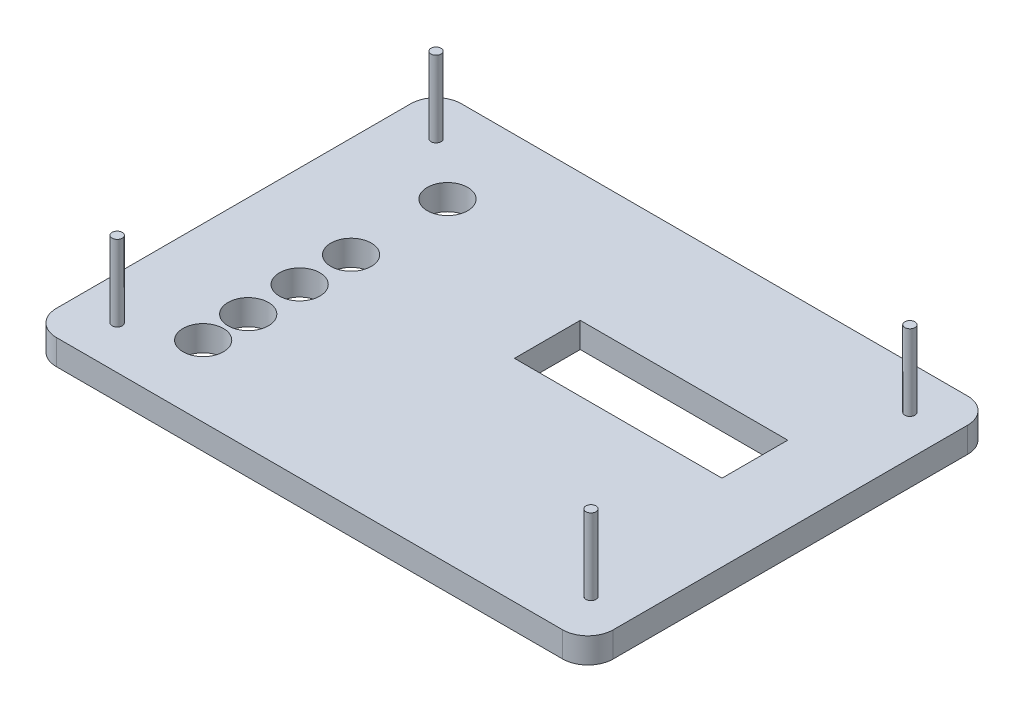
ISO-10303-21;
HEADER;
FILE_DESCRIPTION(('STEP AP214'),'2;1');
FILE_NAME('part.step','',(''),(''),'','','');
FILE_SCHEMA(('AUTOMOTIVE_DESIGN { 1 0 10303 214 1 1 1 1 }'));
ENDSEC;
DATA;
#1=APPLICATION_CONTEXT('core data for automotive mechanical design processes');
#2=APPLICATION_PROTOCOL_DEFINITION('international standard','automotive_design',2000,#1);
#3=PRODUCT_CONTEXT('',#1,'mechanical');
#4=PRODUCT('Part','Part','',(#3));
#5=PRODUCT_RELATED_PRODUCT_CATEGORY('part','',(#4));
#6=PRODUCT_DEFINITION_FORMATION('','',#4);
#7=PRODUCT_DEFINITION_CONTEXT('part definition',#1,'design');
#8=PRODUCT_DEFINITION('design','',#6,#7);
#9=PRODUCT_DEFINITION_SHAPE('','',#8);
#10=(LENGTH_UNIT() NAMED_UNIT(*) SI_UNIT(.MILLI.,.METRE.));
#11=(NAMED_UNIT(*) PLANE_ANGLE_UNIT() SI_UNIT($,.RADIAN.));
#12=(NAMED_UNIT(*) SI_UNIT($,.STERADIAN.) SOLID_ANGLE_UNIT());
#13=UNCERTAINTY_MEASURE_WITH_UNIT(LENGTH_MEASURE(1.E-05),#10,'distance_accuracy_value','');
#14=(GEOMETRIC_REPRESENTATION_CONTEXT(3) GLOBAL_UNCERTAINTY_ASSIGNED_CONTEXT((#13)) GLOBAL_UNIT_ASSIGNED_CONTEXT((#10,
#11,#12)) REPRESENTATION_CONTEXT('',''));
#15=CARTESIAN_POINT('',(0.,0.,0.));
#16=DIRECTION('',(0.,0.,1.));
#17=DIRECTION('',(1.,0.,0.));
#18=AXIS2_PLACEMENT_3D('',#15,#16,#17);
#19=CARTESIAN_POINT('',(0.,5.,0.));
#20=DIRECTION('',(0.,-1.,0.));
#21=DIRECTION('',(0.,0.,-1.));
#22=AXIS2_PLACEMENT_3D('',#19,#20,#21);
#23=PLANE('',#22);
#24=DIRECTION('',(-1.,0.,0.));
#25=VECTOR('',#24,1.);
#26=CARTESIAN_POINT('',(39.8,5.,-1.68));
#27=LINE('',#26,#25);
#28=CARTESIAN_POINT('',(39.8,5.,-1.68));
#29=VERTEX_POINT('',#28);
#30=CARTESIAN_POINT('',(-1.20000000000001,5.,-1.68000000000001));
#31=VERTEX_POINT('',#30);
#32=EDGE_CURVE('E133',#29,#31,#27,.T.);
#33=ORIENTED_EDGE('',*,*,#32,.T.);
#34=DIRECTION('',(0.,0.,-1.));
#35=VECTOR('',#34,1.);
#36=CARTESIAN_POINT('',(-1.20000000000001,5.,-14.68));
#37=LINE('',#36,#35);
#38=CARTESIAN_POINT('',(-1.20000000000001,5.,-14.68));
#39=VERTEX_POINT('',#38);
#40=EDGE_CURVE('E127',#31,#39,#37,.T.);
#41=ORIENTED_EDGE('',*,*,#40,.T.);
#42=DIRECTION('',(1.,0.,0.));
#43=VECTOR('',#42,1.);
#44=CARTESIAN_POINT('',(39.8,5.,-14.68));
#45=LINE('',#44,#43);
#46=CARTESIAN_POINT('',(39.8,5.,-14.68));
#47=VERTEX_POINT('',#46);
#48=EDGE_CURVE('E136',#39,#47,#45,.T.);
#49=ORIENTED_EDGE('',*,*,#48,.T.);
#50=DIRECTION('',(0.,0.,1.));
#51=VECTOR('',#50,1.);
#52=CARTESIAN_POINT('',(39.8,5.,-14.68));
#53=LINE('',#52,#51);
#54=EDGE_CURVE('E51',#47,#29,#53,.T.);
#55=ORIENTED_EDGE('',*,*,#54,.T.);
#56=EDGE_LOOP('',(#33,#41,#49,#55));
#57=FACE_BOUND('',#56,.T.);
#58=CARTESIAN_POINT('',(-46.5,5.,31.5));
#59=DIRECTION('',(0.,-1.,0.));
#60=DIRECTION('',(0.,0.,-1.));
#61=AXIS2_PLACEMENT_3D('',#58,#59,#60);
#62=CIRCLE('',#61,0.999999999999998);
#63=CARTESIAN_POINT('',(-46.5,5.,30.5));
#64=VERTEX_POINT('',#63);
#65=EDGE_CURVE('E161',#64,#64,#62,.T.);
#66=ORIENTED_EDGE('',*,*,#65,.T.);
#67=EDGE_LOOP('',(#66));
#68=FACE_BOUND('',#67,.T.);
#69=CARTESIAN_POINT('',(47.1,5.,31.5));
#70=DIRECTION('',(0.,-1.,0.));
#71=DIRECTION('',(0.,0.,-1.));
#72=AXIS2_PLACEMENT_3D('',#69,#70,#71);
#73=CIRCLE('',#72,0.999999999999998);
#74=CARTESIAN_POINT('',(47.1,5.,30.5));
#75=VERTEX_POINT('',#74);
#76=EDGE_CURVE('E167',#75,#75,#73,.T.);
#77=ORIENTED_EDGE('',*,*,#76,.T.);
#78=EDGE_LOOP('',(#77));
#79=FACE_BOUND('',#78,.T.);
#80=CARTESIAN_POINT('',(47.1,5.,-31.5));
#81=DIRECTION('',(0.,-1.,0.));
#82=DIRECTION('',(0.,0.,-1.));
#83=AXIS2_PLACEMENT_3D('',#80,#81,#82);
#84=CIRCLE('',#83,0.999999999999998);
#85=CARTESIAN_POINT('',(47.1,5.,-32.5));
#86=VERTEX_POINT('',#85);
#87=EDGE_CURVE('E235',#86,#86,#84,.F.);
#88=ORIENTED_EDGE('',*,*,#87,.F.);
#89=EDGE_LOOP('',(#88));
#90=FACE_BOUND('',#89,.T.);
#91=CARTESIAN_POINT('',(-46.5,5.,-31.5));
#92=DIRECTION('',(0.,-1.,0.));
#93=DIRECTION('',(0.,0.,-1.));
#94=AXIS2_PLACEMENT_3D('',#91,#92,#93);
#95=CIRCLE('',#94,0.999999999999998);
#96=CARTESIAN_POINT('',(-46.5,5.,-32.5));
#97=VERTEX_POINT('',#96);
#98=EDGE_CURVE('E222',#97,#97,#95,.F.);
#99=ORIENTED_EDGE('',*,*,#98,.F.);
#100=EDGE_LOOP('',(#99));
#101=FACE_BOUND('',#100,.T.);
#102=DIRECTION('',(0.,0.,1.));
#103=VECTOR('',#102,1.);
#104=CARTESIAN_POINT('',(-55.,5.,40.));
#105=LINE('',#104,#103);
#106=CARTESIAN_POINT('',(-55.,5.,-35.));
#107=VERTEX_POINT('',#106);
#108=CARTESIAN_POINT('',(-55.,5.,35.));
#109=VERTEX_POINT('',#108);
#110=EDGE_CURVE('E216',#107,#109,#105,.T.);
#111=ORIENTED_EDGE('',*,*,#110,.T.);
#112=CARTESIAN_POINT('',(-50.,5.,35.));
#113=DIRECTION('',(0.,-1.,0.));
#114=DIRECTION('',(0.,0.,-1.));
#115=AXIS2_PLACEMENT_3D('',#112,#113,#114);
#116=CIRCLE('',#115,5.);
#117=CARTESIAN_POINT('',(-50.,5.,40.));
#118=VERTEX_POINT('',#117);
#119=EDGE_CURVE('E262',#109,#118,#116,.F.);
#120=ORIENTED_EDGE('',*,*,#119,.T.);
#121=DIRECTION('',(1.,0.,0.));
#122=VECTOR('',#121,1.);
#123=CARTESIAN_POINT('',(-55.,5.,40.));
#124=LINE('',#123,#122);
#125=CARTESIAN_POINT('',(50.,5.,40.));
#126=VERTEX_POINT('',#125);
#127=EDGE_CURVE('E219',#118,#126,#124,.T.);
#128=ORIENTED_EDGE('',*,*,#127,.T.);
#129=CARTESIAN_POINT('',(50.,5.,35.));
#130=DIRECTION('',(0.,-1.,0.));
#131=DIRECTION('',(0.,0.,-1.));
#132=AXIS2_PLACEMENT_3D('',#129,#130,#131);
#133=CIRCLE('',#132,5.);
#134=CARTESIAN_POINT('',(55.,5.,35.));
#135=VERTEX_POINT('',#134);
#136=EDGE_CURVE('E260',#126,#135,#133,.F.);
#137=ORIENTED_EDGE('',*,*,#136,.T.);
#138=DIRECTION('',(0.,0.,-1.));
#139=VECTOR('',#138,1.);
#140=CARTESIAN_POINT('',(55.,5.,40.));
#141=LINE('',#140,#139);
#142=CARTESIAN_POINT('',(55.,5.,-35.));
#143=VERTEX_POINT('',#142);
#144=EDGE_CURVE('E209',#135,#143,#141,.T.);
#145=ORIENTED_EDGE('',*,*,#144,.T.);
#146=CARTESIAN_POINT('',(50.,5.,-35.));
#147=DIRECTION('',(0.,-1.,0.));
#148=DIRECTION('',(0.,0.,-1.));
#149=AXIS2_PLACEMENT_3D('',#146,#147,#148);
#150=CIRCLE('',#149,5.);
#151=CARTESIAN_POINT('',(50.,5.,-40.));
#152=VERTEX_POINT('',#151);
#153=EDGE_CURVE('E258',#143,#152,#150,.F.);
#154=ORIENTED_EDGE('',*,*,#153,.T.);
#155=DIRECTION('',(-1.,0.,0.));
#156=VECTOR('',#155,1.);
#157=CARTESIAN_POINT('',(-55.,5.,-40.));
#158=LINE('',#157,#156);
#159=CARTESIAN_POINT('',(-50.,5.,-40.));
#160=VERTEX_POINT('',#159);
#161=EDGE_CURVE('E212',#152,#160,#158,.T.);
#162=ORIENTED_EDGE('',*,*,#161,.T.);
#163=CARTESIAN_POINT('',(-50.,5.,-35.));
#164=DIRECTION('',(0.,-1.,0.));
#165=DIRECTION('',(0.,0.,-1.));
#166=AXIS2_PLACEMENT_3D('',#163,#164,#165);
#167=CIRCLE('',#166,5.);
#168=EDGE_CURVE('E256',#160,#107,#167,.F.);
#169=ORIENTED_EDGE('',*,*,#168,.T.);
#170=EDGE_LOOP('',(#111,#120,#128,#137,#145,#154,#162,#169));
#171=FACE_BOUND('',#170,.T.);
#172=CARTESIAN_POINT('',(-35.06,5.,-22.32));
#173=DIRECTION('',(0.,1.,0.));
#174=DIRECTION('',(0.,0.,1.));
#175=AXIS2_PLACEMENT_3D('',#172,#173,#174);
#176=CIRCLE('',#175,4.);
#177=CARTESIAN_POINT('',(-35.06,5.,-18.32));
#178=VERTEX_POINT('',#177);
#179=EDGE_CURVE('E203',#178,#178,#176,.T.);
#180=ORIENTED_EDGE('',*,*,#179,.F.);
#181=EDGE_LOOP('',(#180));
#182=FACE_BOUND('',#181,.T.);
#183=CARTESIAN_POINT('',(-35.06,5.,-3.27));
#184=DIRECTION('',(0.,1.,0.));
#185=DIRECTION('',(0.,0.,1.));
#186=AXIS2_PLACEMENT_3D('',#183,#184,#185);
#187=CIRCLE('',#186,4.);
#188=CARTESIAN_POINT('',(-35.06,5.,0.730000000000001));
#189=VERTEX_POINT('',#188);
#190=EDGE_CURVE('E197',#189,#189,#187,.T.);
#191=ORIENTED_EDGE('',*,*,#190,.F.);
#192=EDGE_LOOP('',(#191));
#193=FACE_BOUND('',#192,.T.);
#194=CARTESIAN_POINT('',(-35.06,5.,6.89));
#195=DIRECTION('',(0.,1.,0.));
#196=DIRECTION('',(0.,0.,1.));
#197=AXIS2_PLACEMENT_3D('',#194,#195,#196);
#198=CIRCLE('',#197,4.);
#199=CARTESIAN_POINT('',(-35.06,5.,10.89));
#200=VERTEX_POINT('',#199);
#201=EDGE_CURVE('E191',#200,#200,#198,.T.);
#202=ORIENTED_EDGE('',*,*,#201,.F.);
#203=EDGE_LOOP('',(#202));
#204=FACE_BOUND('',#203,.T.);
#205=CARTESIAN_POINT('',(-35.06,5.,17.05));
#206=DIRECTION('',(0.,1.,0.));
#207=DIRECTION('',(0.,0.,1.));
#208=AXIS2_PLACEMENT_3D('',#205,#206,#207);
#209=CIRCLE('',#208,4.);
#210=CARTESIAN_POINT('',(-35.06,5.,21.05));
#211=VERTEX_POINT('',#210);
#212=EDGE_CURVE('E185',#211,#211,#209,.T.);
#213=ORIENTED_EDGE('',*,*,#212,.F.);
#214=EDGE_LOOP('',(#213));
#215=FACE_BOUND('',#214,.T.);
#216=CARTESIAN_POINT('',(-35.06,5.,25.95));
#217=DIRECTION('',(0.,1.,0.));
#218=DIRECTION('',(0.,0.,1.));
#219=AXIS2_PLACEMENT_3D('',#216,#217,#218);
#220=CIRCLE('',#219,4.);
#221=CARTESIAN_POINT('',(-35.06,5.,29.95));
#222=VERTEX_POINT('',#221);
#223=EDGE_CURVE('E179',#222,#222,#220,.T.);
#224=ORIENTED_EDGE('',*,*,#223,.F.);
#225=EDGE_LOOP('',(#224));
#226=FACE_BOUND('',#225,.T.);
#227=ADVANCED_FACE('F36',(#57,#68,#79,#90,#101,#171,#182,#193,#204,#215,#226),#23,.F.);
#228=CARTESIAN_POINT('',(0.,0.,0.));
#229=DIRECTION('',(0.,-1.,0.));
#230=DIRECTION('',(0.,0.,-1.));
#231=AXIS2_PLACEMENT_3D('',#228,#229,#230);
#232=PLANE('',#231);
#233=DIRECTION('',(0.,0.,-1.));
#234=VECTOR('',#233,1.);
#235=CARTESIAN_POINT('',(-1.20000000000001,0.,-14.68));
#236=LINE('',#235,#234);
#237=CARTESIAN_POINT('',(-1.20000000000001,0.,-1.68000000000001));
#238=VERTEX_POINT('',#237);
#239=CARTESIAN_POINT('',(-1.20000000000001,0.,-14.68));
#240=VERTEX_POINT('',#239);
#241=EDGE_CURVE('E59',#238,#240,#236,.T.);
#242=ORIENTED_EDGE('',*,*,#241,.F.);
#243=DIRECTION('',(-1.,0.,0.));
#244=VECTOR('',#243,1.);
#245=CARTESIAN_POINT('',(39.8,0.,-1.68));
#246=LINE('',#245,#244);
#247=CARTESIAN_POINT('',(39.8,0.,-1.68));
#248=VERTEX_POINT('',#247);
#249=EDGE_CURVE('E142',#248,#238,#246,.T.);
#250=ORIENTED_EDGE('',*,*,#249,.F.);
#251=DIRECTION('',(0.,0.,1.));
#252=VECTOR('',#251,1.);
#253=CARTESIAN_POINT('',(39.8,0.,-14.68));
#254=LINE('',#253,#252);
#255=CARTESIAN_POINT('',(39.8,0.,-14.68));
#256=VERTEX_POINT('',#255);
#257=EDGE_CURVE('E145',#256,#248,#254,.T.);
#258=ORIENTED_EDGE('',*,*,#257,.F.);
#259=DIRECTION('',(1.,0.,0.));
#260=VECTOR('',#259,1.);
#261=CARTESIAN_POINT('',(39.8,0.,-14.68));
#262=LINE('',#261,#260);
#263=EDGE_CURVE('E151',#240,#256,#262,.T.);
#264=ORIENTED_EDGE('',*,*,#263,.F.);
#265=EDGE_LOOP('',(#242,#250,#258,#264));
#266=FACE_BOUND('',#265,.T.);
#267=CARTESIAN_POINT('',(-35.06,0.,17.05));
#268=DIRECTION('',(0.,1.,0.));
#269=DIRECTION('',(0.,0.,1.));
#270=AXIS2_PLACEMENT_3D('',#267,#268,#269);
#271=CIRCLE('',#270,4.);
#272=CARTESIAN_POINT('',(-35.06,0.,21.05));
#273=VERTEX_POINT('',#272);
#274=EDGE_CURVE('E182',#273,#273,#271,.T.);
#275=ORIENTED_EDGE('',*,*,#274,.T.);
#276=EDGE_LOOP('',(#275));
#277=FACE_BOUND('',#276,.T.);
#278=CARTESIAN_POINT('',(-35.06,0.,-3.27));
#279=DIRECTION('',(0.,1.,0.));
#280=DIRECTION('',(0.,0.,1.));
#281=AXIS2_PLACEMENT_3D('',#278,#279,#280);
#282=CIRCLE('',#281,4.);
#283=CARTESIAN_POINT('',(-35.06,0.,0.730000000000001));
#284=VERTEX_POINT('',#283);
#285=EDGE_CURVE('E194',#284,#284,#282,.T.);
#286=ORIENTED_EDGE('',*,*,#285,.T.);
#287=EDGE_LOOP('',(#286));
#288=FACE_BOUND('',#287,.T.);
#289=DIRECTION('',(1.,0.,0.));
#290=VECTOR('',#289,1.);
#291=CARTESIAN_POINT('',(-55.,0.,40.));
#292=LINE('',#291,#290);
#293=CARTESIAN_POINT('',(-50.,0.,40.));
#294=VERTEX_POINT('',#293);
#295=CARTESIAN_POINT('',(50.,0.,40.));
#296=VERTEX_POINT('',#295);
#297=EDGE_CURVE('E213',#294,#296,#292,.T.);
#298=ORIENTED_EDGE('',*,*,#297,.F.);
#299=CARTESIAN_POINT('',(-50.,0.,35.));
#300=DIRECTION('',(0.,-1.,0.));
#301=DIRECTION('',(0.,0.,-1.));
#302=AXIS2_PLACEMENT_3D('',#299,#300,#301);
#303=CIRCLE('',#302,5.);
#304=CARTESIAN_POINT('',(-55.,0.,35.));
#305=VERTEX_POINT('',#304);
#306=EDGE_CURVE('E249',#294,#305,#303,.T.);
#307=ORIENTED_EDGE('',*,*,#306,.T.);
#308=DIRECTION('',(0.,0.,1.));
#309=VECTOR('',#308,1.);
#310=CARTESIAN_POINT('',(-55.,0.,40.));
#311=LINE('',#310,#309);
#312=CARTESIAN_POINT('',(-55.,0.,-35.));
#313=VERTEX_POINT('',#312);
#314=EDGE_CURVE('E228',#313,#305,#311,.T.);
#315=ORIENTED_EDGE('',*,*,#314,.F.);
#316=CARTESIAN_POINT('',(-50.,0.,-35.));
#317=DIRECTION('',(0.,-1.,0.));
#318=DIRECTION('',(0.,0.,-1.));
#319=AXIS2_PLACEMENT_3D('',#316,#317,#318);
#320=CIRCLE('',#319,5.);
#321=CARTESIAN_POINT('',(-50.,0.,-40.));
#322=VERTEX_POINT('',#321);
#323=EDGE_CURVE('E243',#313,#322,#320,.T.);
#324=ORIENTED_EDGE('',*,*,#323,.T.);
#325=DIRECTION('',(-1.,0.,0.));
#326=VECTOR('',#325,1.);
#327=CARTESIAN_POINT('',(-55.,0.,-40.));
#328=LINE('',#327,#326);
#329=CARTESIAN_POINT('',(50.,0.,-40.));
#330=VERTEX_POINT('',#329);
#331=EDGE_CURVE('E225',#330,#322,#328,.T.);
#332=ORIENTED_EDGE('',*,*,#331,.F.);
#333=CARTESIAN_POINT('',(50.,0.,-35.));
#334=DIRECTION('',(0.,-1.,0.));
#335=DIRECTION('',(0.,0.,-1.));
#336=AXIS2_PLACEMENT_3D('',#333,#334,#335);
#337=CIRCLE('',#336,5.);
#338=CARTESIAN_POINT('',(55.,0.,-35.));
#339=VERTEX_POINT('',#338);
#340=EDGE_CURVE('E245',#330,#339,#337,.T.);
#341=ORIENTED_EDGE('',*,*,#340,.T.);
#342=DIRECTION('',(0.,0.,-1.));
#343=VECTOR('',#342,1.);
#344=CARTESIAN_POINT('',(55.,0.,40.));
#345=LINE('',#344,#343);
#346=CARTESIAN_POINT('',(55.,0.,35.));
#347=VERTEX_POINT('',#346);
#348=EDGE_CURVE('E206',#347,#339,#345,.T.);
#349=ORIENTED_EDGE('',*,*,#348,.F.);
#350=CARTESIAN_POINT('',(50.,0.,35.));
#351=DIRECTION('',(0.,-1.,0.));
#352=DIRECTION('',(0.,0.,-1.));
#353=AXIS2_PLACEMENT_3D('',#350,#351,#352);
#354=CIRCLE('',#353,5.);
#355=EDGE_CURVE('E247',#347,#296,#354,.T.);
#356=ORIENTED_EDGE('',*,*,#355,.T.);
#357=EDGE_LOOP('',(#298,#307,#315,#324,#332,#341,#349,#356));
#358=FACE_BOUND('',#357,.T.);
#359=CARTESIAN_POINT('',(-35.06,0.,-22.32));
#360=DIRECTION('',(0.,1.,0.));
#361=DIRECTION('',(0.,0.,1.));
#362=AXIS2_PLACEMENT_3D('',#359,#360,#361);
#363=CIRCLE('',#362,4.);
#364=CARTESIAN_POINT('',(-35.06,0.,-18.32));
#365=VERTEX_POINT('',#364);
#366=EDGE_CURVE('E200',#365,#365,#363,.T.);
#367=ORIENTED_EDGE('',*,*,#366,.T.);
#368=EDGE_LOOP('',(#367));
#369=FACE_BOUND('',#368,.T.);
#370=CARTESIAN_POINT('',(-35.06,0.,6.89));
#371=DIRECTION('',(0.,1.,0.));
#372=DIRECTION('',(0.,0.,1.));
#373=AXIS2_PLACEMENT_3D('',#370,#371,#372);
#374=CIRCLE('',#373,4.);
#375=CARTESIAN_POINT('',(-35.06,0.,10.89));
#376=VERTEX_POINT('',#375);
#377=EDGE_CURVE('E188',#376,#376,#374,.T.);
#378=ORIENTED_EDGE('',*,*,#377,.T.);
#379=EDGE_LOOP('',(#378));
#380=FACE_BOUND('',#379,.T.);
#381=CARTESIAN_POINT('',(-35.06,0.,25.95));
#382=DIRECTION('',(0.,1.,0.));
#383=DIRECTION('',(0.,0.,1.));
#384=AXIS2_PLACEMENT_3D('',#381,#382,#383);
#385=CIRCLE('',#384,4.);
#386=CARTESIAN_POINT('',(-35.06,0.,29.95));
#387=VERTEX_POINT('',#386);
#388=EDGE_CURVE('E178',#387,#387,#385,.T.);
#389=ORIENTED_EDGE('',*,*,#388,.T.);
#390=EDGE_LOOP('',(#389));
#391=FACE_BOUND('',#390,.T.);
#392=ADVANCED_FACE('F287',(#266,#277,#288,#358,#369,#380,#391),#232,.T.);
#393=CARTESIAN_POINT('',(55.,5.,40.));
#394=DIRECTION('',(-1.,0.,0.));
#395=DIRECTION('',(0.,0.,1.));
#396=AXIS2_PLACEMENT_3D('',#393,#394,#395);
#397=PLANE('',#396);
#398=ORIENTED_EDGE('',*,*,#144,.F.);
#399=DIRECTION('',(0.,-1.,0.));
#400=VECTOR('',#399,1.);
#401=CARTESIAN_POINT('',(55.,5.,35.));
#402=LINE('',#401,#400);
#403=EDGE_CURVE('E266',#135,#347,#402,.T.);
#404=ORIENTED_EDGE('',*,*,#403,.T.);
#405=ORIENTED_EDGE('',*,*,#348,.T.);
#406=DIRECTION('',(0.,-1.,0.));
#407=VECTOR('',#406,1.);
#408=CARTESIAN_POINT('',(55.,5.,-35.));
#409=LINE('',#408,#407);
#410=EDGE_CURVE('E264',#339,#143,#409,.F.);
#411=ORIENTED_EDGE('',*,*,#410,.T.);
#412=EDGE_LOOP('',(#398,#404,#405,#411));
#413=FACE_BOUND('',#412,.T.);
#414=ADVANCED_FACE('F304',(#413),#397,.F.);
#415=CARTESIAN_POINT('',(-55.,5.,-40.));
#416=DIRECTION('',(0.,0.,1.));
#417=DIRECTION('',(1.,0.,0.));
#418=AXIS2_PLACEMENT_3D('',#415,#416,#417);
#419=PLANE('',#418);
#420=ORIENTED_EDGE('',*,*,#161,.F.);
#421=DIRECTION('',(0.,-1.,0.));
#422=VECTOR('',#421,1.);
#423=CARTESIAN_POINT('',(50.,5.,-40.));
#424=LINE('',#423,#422);
#425=EDGE_CURVE('E11',#152,#330,#424,.T.);
#426=ORIENTED_EDGE('',*,*,#425,.T.);
#427=ORIENTED_EDGE('',*,*,#331,.T.);
#428=DIRECTION('',(0.,-1.,0.));
#429=VECTOR('',#428,1.);
#430=CARTESIAN_POINT('',(-50.,5.,-40.));
#431=LINE('',#430,#429);
#432=EDGE_CURVE('E44',#322,#160,#431,.F.);
#433=ORIENTED_EDGE('',*,*,#432,.T.);
#434=EDGE_LOOP('',(#420,#426,#427,#433));
#435=FACE_BOUND('',#434,.T.);
#436=ADVANCED_FACE('F271',(#435),#419,.F.);
#437=CARTESIAN_POINT('',(-55.,5.,40.));
#438=DIRECTION('',(1.,0.,0.));
#439=DIRECTION('',(0.,0.,-1.));
#440=AXIS2_PLACEMENT_3D('',#437,#438,#439);
#441=PLANE('',#440);
#442=ORIENTED_EDGE('',*,*,#314,.T.);
#443=DIRECTION('',(0.,-1.,0.));
#444=VECTOR('',#443,1.);
#445=CARTESIAN_POINT('',(-55.,5.,35.));
#446=LINE('',#445,#444);
#447=EDGE_CURVE('E254',#305,#109,#446,.F.);
#448=ORIENTED_EDGE('',*,*,#447,.T.);
#449=ORIENTED_EDGE('',*,*,#110,.F.);
#450=DIRECTION('',(0.,-1.,0.));
#451=VECTOR('',#450,1.);
#452=CARTESIAN_POINT('',(-55.,5.,-35.));
#453=LINE('',#452,#451);
#454=EDGE_CURVE('E251',#107,#313,#453,.T.);
#455=ORIENTED_EDGE('',*,*,#454,.T.);
#456=EDGE_LOOP('',(#442,#448,#449,#455));
#457=FACE_BOUND('',#456,.T.);
#458=ADVANCED_FACE('F283',(#457),#441,.F.);
#459=CARTESIAN_POINT('',(-55.,5.,40.));
#460=DIRECTION('',(0.,0.,-1.));
#461=DIRECTION('',(-1.,0.,0.));
#462=AXIS2_PLACEMENT_3D('',#459,#460,#461);
#463=PLANE('',#462);
#464=ORIENTED_EDGE('',*,*,#127,.F.);
#465=DIRECTION('',(0.,-1.,0.));
#466=VECTOR('',#465,1.);
#467=CARTESIAN_POINT('',(-50.,5.,40.));
#468=LINE('',#467,#466);
#469=EDGE_CURVE('E240',#118,#294,#468,.T.);
#470=ORIENTED_EDGE('',*,*,#469,.T.);
#471=ORIENTED_EDGE('',*,*,#297,.T.);
#472=DIRECTION('',(0.,-1.,0.));
#473=VECTOR('',#472,1.);
#474=CARTESIAN_POINT('',(50.,5.,40.));
#475=LINE('',#474,#473);
#476=EDGE_CURVE('E238',#296,#126,#475,.F.);
#477=ORIENTED_EDGE('',*,*,#476,.T.);
#478=EDGE_LOOP('',(#464,#470,#471,#477));
#479=FACE_BOUND('',#478,.T.);
#480=ADVANCED_FACE('F295',(#479),#463,.F.);
#481=CARTESIAN_POINT('',(-35.06,5.,-22.32));
#482=DIRECTION('',(0.,-1.,0.));
#483=DIRECTION('',(0.,0.,-1.));
#484=AXIS2_PLACEMENT_3D('',#481,#482,#483);
#485=CYLINDRICAL_SURFACE('',#484,4.);
#486=ORIENTED_EDGE('',*,*,#179,.T.);
#487=EDGE_LOOP('',(#486));
#488=FACE_BOUND('',#487,.T.);
#489=ORIENTED_EDGE('',*,*,#366,.F.);
#490=EDGE_LOOP('',(#489));
#491=FACE_BOUND('',#490,.T.);
#492=ADVANCED_FACE('F322',(#488,#491),#485,.F.);
#493=CARTESIAN_POINT('',(-35.06,5.,-3.27));
#494=DIRECTION('',(0.,-1.,0.));
#495=DIRECTION('',(0.,0.,-1.));
#496=AXIS2_PLACEMENT_3D('',#493,#494,#495);
#497=CYLINDRICAL_SURFACE('',#496,4.);
#498=ORIENTED_EDGE('',*,*,#190,.T.);
#499=EDGE_LOOP('',(#498));
#500=FACE_BOUND('',#499,.T.);
#501=ORIENTED_EDGE('',*,*,#285,.F.);
#502=EDGE_LOOP('',(#501));
#503=FACE_BOUND('',#502,.T.);
#504=ADVANCED_FACE('F383',(#500,#503),#497,.F.);
#505=CARTESIAN_POINT('',(-35.06,5.,6.89));
#506=DIRECTION('',(0.,-1.,0.));
#507=DIRECTION('',(0.,0.,-1.));
#508=AXIS2_PLACEMENT_3D('',#505,#506,#507);
#509=CYLINDRICAL_SURFACE('',#508,4.);
#510=ORIENTED_EDGE('',*,*,#201,.T.);
#511=EDGE_LOOP('',(#510));
#512=FACE_BOUND('',#511,.T.);
#513=ORIENTED_EDGE('',*,*,#377,.F.);
#514=EDGE_LOOP('',(#513));
#515=FACE_BOUND('',#514,.T.);
#516=ADVANCED_FACE('F380',(#512,#515),#509,.F.);
#517=CARTESIAN_POINT('',(-35.06,5.,17.05));
#518=DIRECTION('',(0.,-1.,0.));
#519=DIRECTION('',(0.,0.,-1.));
#520=AXIS2_PLACEMENT_3D('',#517,#518,#519);
#521=CYLINDRICAL_SURFACE('',#520,4.);
#522=ORIENTED_EDGE('',*,*,#212,.T.);
#523=EDGE_LOOP('',(#522));
#524=FACE_BOUND('',#523,.T.);
#525=ORIENTED_EDGE('',*,*,#274,.F.);
#526=EDGE_LOOP('',(#525));
#527=FACE_BOUND('',#526,.T.);
#528=ADVANCED_FACE('F376',(#524,#527),#521,.F.);
#529=CARTESIAN_POINT('',(-35.06,5.,25.95));
#530=DIRECTION('',(0.,-1.,0.));
#531=DIRECTION('',(0.,0.,-1.));
#532=AXIS2_PLACEMENT_3D('',#529,#530,#531);
#533=CYLINDRICAL_SURFACE('',#532,4.);
#534=ORIENTED_EDGE('',*,*,#223,.T.);
#535=EDGE_LOOP('',(#534));
#536=FACE_BOUND('',#535,.T.);
#537=ORIENTED_EDGE('',*,*,#388,.F.);
#538=EDGE_LOOP('',(#537));
#539=FACE_BOUND('',#538,.T.);
#540=ADVANCED_FACE('F372',(#536,#539),#533,.F.);
#541=CARTESIAN_POINT('',(-46.5,20.,-31.5));
#542=DIRECTION('',(0.,-1.,0.));
#543=DIRECTION('',(0.,0.,-1.));
#544=AXIS2_PLACEMENT_3D('',#541,#542,#543);
#545=CYLINDRICAL_SURFACE('',#544,0.999999999999998);
#546=CARTESIAN_POINT('',(-46.5,20.,-31.5));
#547=DIRECTION('',(0.,1.,0.));
#548=DIRECTION('',(0.,0.,1.));
#549=AXIS2_PLACEMENT_3D('',#546,#547,#548);
#550=CIRCLE('',#549,0.999999999999998);
#551=CARTESIAN_POINT('',(-46.5,20.,-30.5));
#552=VERTEX_POINT('',#551);
#553=EDGE_CURVE('E175',#552,#552,#550,.T.);
#554=ORIENTED_EDGE('',*,*,#553,.F.);
#555=EDGE_LOOP('',(#554));
#556=FACE_BOUND('',#555,.T.);
#557=ORIENTED_EDGE('',*,*,#98,.T.);
#558=EDGE_LOOP('',(#557));
#559=FACE_BOUND('',#558,.T.);
#560=ADVANCED_FACE('F368',(#556,#559),#545,.T.);
#561=CARTESIAN_POINT('',(-46.5,20.,-31.5));
#562=DIRECTION('',(0.,1.,0.));
#563=DIRECTION('',(0.,0.,1.));
#564=AXIS2_PLACEMENT_3D('',#561,#562,#563);
#565=PLANE('',#564);
#566=ORIENTED_EDGE('',*,*,#553,.T.);
#567=EDGE_LOOP('',(#566));
#568=FACE_BOUND('',#567,.T.);
#569=ADVANCED_FACE('F361',(#568),#565,.T.);
#570=CARTESIAN_POINT('',(47.1,20.,-31.5));
#571=DIRECTION('',(0.,-1.,0.));
#572=DIRECTION('',(0.,0.,-1.));
#573=AXIS2_PLACEMENT_3D('',#570,#571,#572);
#574=CYLINDRICAL_SURFACE('',#573,0.999999999999998);
#575=CARTESIAN_POINT('',(47.1,20.,-31.5));
#576=DIRECTION('',(0.,1.,0.));
#577=DIRECTION('',(0.,0.,1.));
#578=AXIS2_PLACEMENT_3D('',#575,#576,#577);
#579=CIRCLE('',#578,0.999999999999998);
#580=CARTESIAN_POINT('',(47.1,20.,-30.5));
#581=VERTEX_POINT('',#580);
#582=EDGE_CURVE('E170',#581,#581,#579,.T.);
#583=ORIENTED_EDGE('',*,*,#582,.F.);
#584=EDGE_LOOP('',(#583));
#585=FACE_BOUND('',#584,.T.);
#586=ORIENTED_EDGE('',*,*,#87,.T.);
#587=EDGE_LOOP('',(#586));
#588=FACE_BOUND('',#587,.T.);
#589=ADVANCED_FACE('F358',(#585,#588),#574,.T.);
#590=CARTESIAN_POINT('',(47.1,20.,-31.5));
#591=DIRECTION('',(0.,1.,0.));
#592=DIRECTION('',(0.,0.,1.));
#593=AXIS2_PLACEMENT_3D('',#590,#591,#592);
#594=PLANE('',#593);
#595=ORIENTED_EDGE('',*,*,#582,.T.);
#596=EDGE_LOOP('',(#595));
#597=FACE_BOUND('',#596,.T.);
#598=ADVANCED_FACE('F353',(#597),#594,.T.);
#599=CARTESIAN_POINT('',(47.1,20.,31.5));
#600=DIRECTION('',(0.,-1.,0.));
#601=DIRECTION('',(0.,0.,-1.));
#602=AXIS2_PLACEMENT_3D('',#599,#600,#601);
#603=CYLINDRICAL_SURFACE('',#602,0.999999999999998);
#604=CARTESIAN_POINT('',(47.1,20.,31.5));
#605=DIRECTION('',(0.,-1.,0.));
#606=DIRECTION('',(0.,0.,-1.));
#607=AXIS2_PLACEMENT_3D('',#604,#605,#606);
#608=CIRCLE('',#607,0.999999999999998);
#609=CARTESIAN_POINT('',(47.1,20.,30.5));
#610=VERTEX_POINT('',#609);
#611=EDGE_CURVE('E164',#610,#610,#608,.T.);
#612=ORIENTED_EDGE('',*,*,#611,.T.);
#613=EDGE_LOOP('',(#612));
#614=FACE_BOUND('',#613,.T.);
#615=ORIENTED_EDGE('',*,*,#76,.F.);
#616=EDGE_LOOP('',(#615));
#617=FACE_BOUND('',#616,.T.);
#618=ADVANCED_FACE('F350',(#614,#617),#603,.T.);
#619=CARTESIAN_POINT('',(47.1,20.,31.5));
#620=DIRECTION('',(0.,-1.,0.));
#621=DIRECTION('',(0.,0.,-1.));
#622=AXIS2_PLACEMENT_3D('',#619,#620,#621);
#623=PLANE('',#622);
#624=ORIENTED_EDGE('',*,*,#611,.F.);
#625=EDGE_LOOP('',(#624));
#626=FACE_BOUND('',#625,.T.);
#627=ADVANCED_FACE('F344',(#626),#623,.F.);
#628=CARTESIAN_POINT('',(-46.5,20.,31.5));
#629=DIRECTION('',(0.,-1.,0.));
#630=DIRECTION('',(0.,0.,-1.));
#631=AXIS2_PLACEMENT_3D('',#628,#629,#630);
#632=CYLINDRICAL_SURFACE('',#631,0.999999999999998);
#633=CARTESIAN_POINT('',(-46.5,20.,31.5));
#634=DIRECTION('',(0.,-1.,0.));
#635=DIRECTION('',(0.,0.,-1.));
#636=AXIS2_PLACEMENT_3D('',#633,#634,#635);
#637=CIRCLE('',#636,0.999999999999998);
#638=CARTESIAN_POINT('',(-46.5,20.,30.5));
#639=VERTEX_POINT('',#638);
#640=EDGE_CURVE('E157',#639,#639,#637,.T.);
#641=ORIENTED_EDGE('',*,*,#640,.T.);
#642=EDGE_LOOP('',(#641));
#643=FACE_BOUND('',#642,.T.);
#644=ORIENTED_EDGE('',*,*,#65,.F.);
#645=EDGE_LOOP('',(#644));
#646=FACE_BOUND('',#645,.T.);
#647=ADVANCED_FACE('F338',(#643,#646),#632,.T.);
#648=CARTESIAN_POINT('',(-46.5,20.,31.5));
#649=DIRECTION('',(0.,-1.,0.));
#650=DIRECTION('',(0.,0.,-1.));
#651=AXIS2_PLACEMENT_3D('',#648,#649,#650);
#652=PLANE('',#651);
#653=ORIENTED_EDGE('',*,*,#640,.F.);
#654=EDGE_LOOP('',(#653));
#655=FACE_BOUND('',#654,.T.);
#656=ADVANCED_FACE('F334',(#655),#652,.F.);
#657=CARTESIAN_POINT('',(-50.,5.,35.));
#658=DIRECTION('',(0.,-1.,0.));
#659=DIRECTION('',(0.,0.,-1.));
#660=AXIS2_PLACEMENT_3D('',#657,#658,#659);
#661=CYLINDRICAL_SURFACE('',#660,5.);
#662=ORIENTED_EDGE('',*,*,#119,.F.);
#663=ORIENTED_EDGE('',*,*,#447,.F.);
#664=ORIENTED_EDGE('',*,*,#306,.F.);
#665=ORIENTED_EDGE('',*,*,#469,.F.);
#666=EDGE_LOOP('',(#662,#663,#664,#665));
#667=FACE_BOUND('',#666,.T.);
#668=ADVANCED_FACE('F292',(#667),#661,.T.);
#669=CARTESIAN_POINT('',(50.,5.,35.));
#670=DIRECTION('',(0.,-1.,0.));
#671=DIRECTION('',(0.,0.,-1.));
#672=AXIS2_PLACEMENT_3D('',#669,#670,#671);
#673=CYLINDRICAL_SURFACE('',#672,5.);
#674=ORIENTED_EDGE('',*,*,#136,.F.);
#675=ORIENTED_EDGE('',*,*,#476,.F.);
#676=ORIENTED_EDGE('',*,*,#355,.F.);
#677=ORIENTED_EDGE('',*,*,#403,.F.);
#678=EDGE_LOOP('',(#674,#675,#676,#677));
#679=FACE_BOUND('',#678,.T.);
#680=ADVANCED_FACE('F301',(#679),#673,.T.);
#681=CARTESIAN_POINT('',(50.,5.,-35.));
#682=DIRECTION('',(0.,-1.,0.));
#683=DIRECTION('',(0.,0.,-1.));
#684=AXIS2_PLACEMENT_3D('',#681,#682,#683);
#685=CYLINDRICAL_SURFACE('',#684,5.);
#686=ORIENTED_EDGE('',*,*,#153,.F.);
#687=ORIENTED_EDGE('',*,*,#410,.F.);
#688=ORIENTED_EDGE('',*,*,#340,.F.);
#689=ORIENTED_EDGE('',*,*,#425,.F.);
#690=EDGE_LOOP('',(#686,#687,#688,#689));
#691=FACE_BOUND('',#690,.T.);
#692=ADVANCED_FACE('F307',(#691),#685,.T.);
#693=CARTESIAN_POINT('',(-50.,5.,-35.));
#694=DIRECTION('',(0.,-1.,0.));
#695=DIRECTION('',(0.,0.,-1.));
#696=AXIS2_PLACEMENT_3D('',#693,#694,#695);
#697=CYLINDRICAL_SURFACE('',#696,5.);
#698=ORIENTED_EDGE('',*,*,#168,.F.);
#699=ORIENTED_EDGE('',*,*,#432,.F.);
#700=ORIENTED_EDGE('',*,*,#323,.F.);
#701=ORIENTED_EDGE('',*,*,#454,.F.);
#702=EDGE_LOOP('',(#698,#699,#700,#701));
#703=FACE_BOUND('',#702,.T.);
#704=ADVANCED_FACE('F38',(#703),#697,.T.);
#705=CARTESIAN_POINT('',(-1.20000000000001,5.,-14.68));
#706=DIRECTION('',(-1.,0.,0.));
#707=DIRECTION('',(0.,0.,1.));
#708=AXIS2_PLACEMENT_3D('',#705,#706,#707);
#709=PLANE('',#708);
#710=ORIENTED_EDGE('',*,*,#241,.T.);
#711=DIRECTION('',(0.,-1.,0.));
#712=VECTOR('',#711,1.);
#713=CARTESIAN_POINT('',(-1.20000000000001,5.,-14.68));
#714=LINE('',#713,#712);
#715=EDGE_CURVE('E123',#39,#240,#714,.T.);
#716=ORIENTED_EDGE('',*,*,#715,.F.);
#717=ORIENTED_EDGE('',*,*,#40,.F.);
#718=DIRECTION('',(0.,-1.,0.));
#719=VECTOR('',#718,1.);
#720=CARTESIAN_POINT('',(-1.20000000000001,5.,-1.68000000000001));
#721=LINE('',#720,#719);
#722=EDGE_CURVE('E155',#31,#238,#721,.T.);
#723=ORIENTED_EDGE('',*,*,#722,.T.);
#724=EDGE_LOOP('',(#710,#716,#717,#723));
#725=FACE_BOUND('',#724,.T.);
#726=ADVANCED_FACE('F125',(#725),#709,.F.);
#727=CARTESIAN_POINT('',(39.8,5.,-1.68));
#728=DIRECTION('',(0.,0.,1.));
#729=DIRECTION('',(1.,0.,0.));
#730=AXIS2_PLACEMENT_3D('',#727,#728,#729);
#731=PLANE('',#730);
#732=ORIENTED_EDGE('',*,*,#249,.T.);
#733=ORIENTED_EDGE('',*,*,#722,.F.);
#734=ORIENTED_EDGE('',*,*,#32,.F.);
#735=DIRECTION('',(0.,-1.,0.));
#736=VECTOR('',#735,1.);
#737=CARTESIAN_POINT('',(39.8,5.,-1.68));
#738=LINE('',#737,#736);
#739=EDGE_CURVE('E158',#29,#248,#738,.T.);
#740=ORIENTED_EDGE('',*,*,#739,.T.);
#741=EDGE_LOOP('',(#732,#733,#734,#740));
#742=FACE_BOUND('',#741,.T.);
#743=ADVANCED_FACE('F448',(#742),#731,.F.);
#744=CARTESIAN_POINT('',(39.8,5.,-14.68));
#745=DIRECTION('',(1.,0.,0.));
#746=DIRECTION('',(0.,0.,-1.));
#747=AXIS2_PLACEMENT_3D('',#744,#745,#746);
#748=PLANE('',#747);
#749=ORIENTED_EDGE('',*,*,#257,.T.);
#750=ORIENTED_EDGE('',*,*,#739,.F.);
#751=ORIENTED_EDGE('',*,*,#54,.F.);
#752=DIRECTION('',(0.,-1.,0.));
#753=VECTOR('',#752,1.);
#754=CARTESIAN_POINT('',(39.8,5.,-14.68));
#755=LINE('',#754,#753);
#756=EDGE_CURVE('E132',#47,#256,#755,.T.);
#757=ORIENTED_EDGE('',*,*,#756,.T.);
#758=EDGE_LOOP('',(#749,#750,#751,#757));
#759=FACE_BOUND('',#758,.T.);
#760=ADVANCED_FACE('F457',(#759),#748,.F.);
#761=CARTESIAN_POINT('',(39.8,5.,-14.68));
#762=DIRECTION('',(0.,0.,-1.));
#763=DIRECTION('',(-1.,0.,0.));
#764=AXIS2_PLACEMENT_3D('',#761,#762,#763);
#765=PLANE('',#764);
#766=ORIENTED_EDGE('',*,*,#263,.T.);
#767=ORIENTED_EDGE('',*,*,#756,.F.);
#768=ORIENTED_EDGE('',*,*,#48,.F.);
#769=ORIENTED_EDGE('',*,*,#715,.T.);
#770=EDGE_LOOP('',(#766,#767,#768,#769));
#771=FACE_BOUND('',#770,.T.);
#772=ADVANCED_FACE('F137',(#771),#765,.F.);
#773=CLOSED_SHELL('',(#227,#392,#414,#436,#458,#480,#492,#504,#516,#528,#540,#560,#569,#589,
#598,#618,#627,#647,#656,#668,#680,#692,#704,#726,#743,#760,#772));
#774=MANIFOLD_SOLID_BREP('B2',#773);
#775=ADVANCED_BREP_SHAPE_REPRESENTATION('',(#18,#774),#14);
#776=SHAPE_DEFINITION_REPRESENTATION(#9,#775);
ENDSEC;
END-ISO-10303-21;
